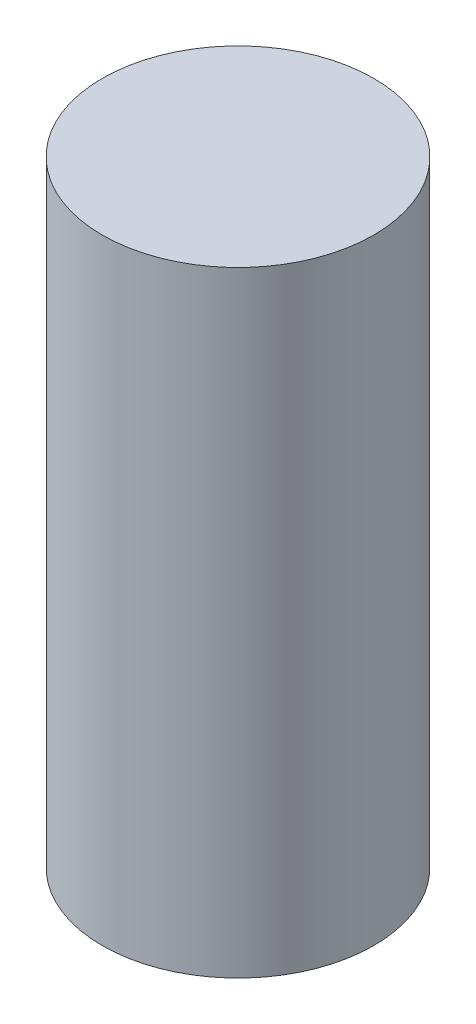
ISO-10303-21;
HEADER;
FILE_DESCRIPTION(('STEP AP214'),'2;1');
FILE_NAME('part.step','',(''),(''),'','','');
FILE_SCHEMA(('AUTOMOTIVE_DESIGN { 1 0 10303 214 1 1 1 1 }'));
ENDSEC;
DATA;
#1=APPLICATION_CONTEXT('core data for automotive mechanical design processes');
#2=APPLICATION_PROTOCOL_DEFINITION('international standard','automotive_design',2000,#1);
#3=PRODUCT_CONTEXT('',#1,'mechanical');
#4=PRODUCT('Part','Part','',(#3));
#5=PRODUCT_RELATED_PRODUCT_CATEGORY('part','',(#4));
#6=PRODUCT_DEFINITION_FORMATION('','',#4);
#7=PRODUCT_DEFINITION_CONTEXT('part definition',#1,'design');
#8=PRODUCT_DEFINITION('design','',#6,#7);
#9=PRODUCT_DEFINITION_SHAPE('','',#8);
#10=(LENGTH_UNIT() NAMED_UNIT(*) SI_UNIT(.MILLI.,.METRE.));
#11=(NAMED_UNIT(*) PLANE_ANGLE_UNIT() SI_UNIT($,.RADIAN.));
#12=(NAMED_UNIT(*) SI_UNIT($,.STERADIAN.) SOLID_ANGLE_UNIT());
#13=UNCERTAINTY_MEASURE_WITH_UNIT(LENGTH_MEASURE(1.E-05),#10,'distance_accuracy_value','');
#14=(GEOMETRIC_REPRESENTATION_CONTEXT(3) GLOBAL_UNCERTAINTY_ASSIGNED_CONTEXT((#13)) GLOBAL_UNIT_ASSIGNED_CONTEXT((#10,
#11,#12)) REPRESENTATION_CONTEXT('',''));
#15=CARTESIAN_POINT('',(0.,0.,0.));
#16=DIRECTION('',(0.,0.,1.));
#17=DIRECTION('',(1.,0.,0.));
#18=AXIS2_PLACEMENT_3D('',#15,#16,#17);
#19=CARTESIAN_POINT('',(0.,9.,0.));
#20=DIRECTION('',(0.,-1.,0.));
#21=DIRECTION('',(0.,0.,-1.));
#22=AXIS2_PLACEMENT_3D('',#19,#20,#21);
#23=CYLINDRICAL_SURFACE('',#22,1.985);
#24=CARTESIAN_POINT('',(0.,9.,0.));
#25=DIRECTION('',(0.,1.,0.));
#26=DIRECTION('',(0.,0.,1.));
#27=AXIS2_PLACEMENT_3D('',#24,#25,#26);
#28=CIRCLE('',#27,1.985);
#29=CARTESIAN_POINT('',(0.,9.,1.985));
#30=VERTEX_POINT('',#29);
#31=EDGE_CURVE('E10',#30,#30,#28,.T.);
#32=ORIENTED_EDGE('',*,*,#31,.F.);
#33=EDGE_LOOP('',(#32));
#34=FACE_BOUND('',#33,.T.);
#35=CARTESIAN_POINT('',(0.,0.,0.));
#36=DIRECTION('',(0.,1.,0.));
#37=DIRECTION('',(0.,0.,1.));
#38=AXIS2_PLACEMENT_3D('',#35,#36,#37);
#39=CIRCLE('',#38,1.985);
#40=CARTESIAN_POINT('',(0.,0.,1.985));
#41=VERTEX_POINT('',#40);
#42=EDGE_CURVE('E46',#41,#41,#39,.T.);
#43=ORIENTED_EDGE('',*,*,#42,.T.);
#44=EDGE_LOOP('',(#43));
#45=FACE_BOUND('',#44,.T.);
#46=ADVANCED_FACE('F43',(#34,#45),#23,.T.);
#47=CARTESIAN_POINT('',(0.,9.,0.));
#48=DIRECTION('',(0.,1.,0.));
#49=DIRECTION('',(0.,0.,1.));
#50=AXIS2_PLACEMENT_3D('',#47,#48,#49);
#51=PLANE('',#50);
#52=ORIENTED_EDGE('',*,*,#31,.T.);
#53=EDGE_LOOP('',(#52));
#54=FACE_BOUND('',#53,.T.);
#55=ADVANCED_FACE('F60',(#54),#51,.T.);
#56=CARTESIAN_POINT('',(0.,0.,0.));
#57=DIRECTION('',(0.,1.,0.));
#58=DIRECTION('',(0.,0.,1.));
#59=AXIS2_PLACEMENT_3D('',#56,#57,#58);
#60=PLANE('',#59);
#61=ORIENTED_EDGE('',*,*,#42,.F.);
#62=EDGE_LOOP('',(#61));
#63=FACE_BOUND('',#62,.T.);
#64=ADVANCED_FACE('F58',(#63),#60,.F.);
#65=CLOSED_SHELL('',(#46,#55,#64));
#66=MANIFOLD_SOLID_BREP('B2',#65);
#67=ADVANCED_BREP_SHAPE_REPRESENTATION('',(#18,#66),#14);
#68=SHAPE_DEFINITION_REPRESENTATION(#9,#67);
ENDSEC;
END-ISO-10303-21;
